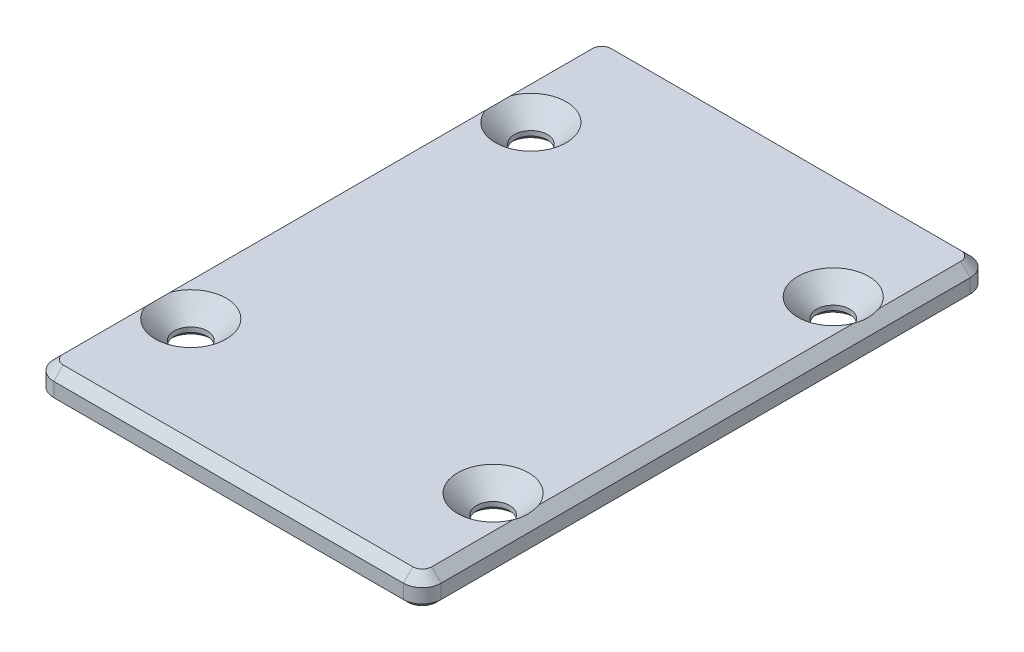
ISO-10303-21;
HEADER;
FILE_DESCRIPTION(('STEP AP214'),'2;1');
FILE_NAME('part.step','',(''),(''),'','','');
FILE_SCHEMA(('AUTOMOTIVE_DESIGN { 1 0 10303 214 1 1 1 1 }'));
ENDSEC;
DATA;
#1=APPLICATION_CONTEXT('core data for automotive mechanical design processes');
#2=APPLICATION_PROTOCOL_DEFINITION('international standard','automotive_design',2000,#1);
#3=PRODUCT_CONTEXT('',#1,'mechanical');
#4=PRODUCT('Part','Part','',(#3));
#5=PRODUCT_RELATED_PRODUCT_CATEGORY('part','',(#4));
#6=PRODUCT_DEFINITION_FORMATION('','',#4);
#7=PRODUCT_DEFINITION_CONTEXT('part definition',#1,'design');
#8=PRODUCT_DEFINITION('design','',#6,#7);
#9=PRODUCT_DEFINITION_SHAPE('','',#8);
#10=(LENGTH_UNIT() NAMED_UNIT(*) SI_UNIT(.MILLI.,.METRE.));
#11=(NAMED_UNIT(*) PLANE_ANGLE_UNIT() SI_UNIT($,.RADIAN.));
#12=(NAMED_UNIT(*) SI_UNIT($,.STERADIAN.) SOLID_ANGLE_UNIT());
#13=UNCERTAINTY_MEASURE_WITH_UNIT(LENGTH_MEASURE(1.E-05),#10,'distance_accuracy_value','');
#14=(GEOMETRIC_REPRESENTATION_CONTEXT(3) GLOBAL_UNCERTAINTY_ASSIGNED_CONTEXT((#13)) GLOBAL_UNIT_ASSIGNED_CONTEXT((#10,
#11,#12)) REPRESENTATION_CONTEXT('',''));
#15=CARTESIAN_POINT('',(0.,0.,0.));
#16=DIRECTION('',(0.,0.,1.));
#17=DIRECTION('',(1.,0.,0.));
#18=AXIS2_PLACEMENT_3D('',#15,#16,#17);
#19=CARTESIAN_POINT('',(20.5,3.,30.));
#20=DIRECTION('',(-1.,0.,0.));
#21=DIRECTION('',(0.,0.,1.));
#22=AXIS2_PLACEMENT_3D('',#19,#20,#21);
#23=PLANE('',#22);
#24=DIRECTION('',(0.,-1.,0.));
#25=VECTOR('',#24,1.);
#26=CARTESIAN_POINT('',(20.5,3.,28.));
#27=LINE('',#26,#25);
#28=CARTESIAN_POINT('',(20.5,1.99999999999998,28.));
#29=VERTEX_POINT('',#28);
#30=CARTESIAN_POINT('',(20.5,0.499999999999994,28.));
#31=VERTEX_POINT('',#30);
#32=EDGE_CURVE('E248',#29,#31,#27,.T.);
#33=ORIENTED_EDGE('',*,*,#32,.T.);
#34=DIRECTION('',(0.,0.,-1.));
#35=VECTOR('',#34,1.);
#36=CARTESIAN_POINT('',(20.5,0.499999999999994,-28.));
#37=LINE('',#36,#35);
#38=CARTESIAN_POINT('',(20.5,0.499999999999994,-28.));
#39=VERTEX_POINT('',#38);
#40=EDGE_CURVE('E68',#31,#39,#37,.T.);
#41=ORIENTED_EDGE('',*,*,#40,.T.);
#42=DIRECTION('',(0.,-1.,0.));
#43=VECTOR('',#42,1.);
#44=CARTESIAN_POINT('',(20.5,3.,-28.));
#45=LINE('',#44,#43);
#46=CARTESIAN_POINT('',(20.5,1.99999999999998,-28.));
#47=VERTEX_POINT('',#46);
#48=EDGE_CURVE('E245',#39,#47,#45,.F.);
#49=ORIENTED_EDGE('',*,*,#48,.T.);
#50=DIRECTION('',(0.,0.,1.));
#51=VECTOR('',#50,1.);
#52=CARTESIAN_POINT('',(20.5,1.99999999999998,30.));
#53=LINE('',#52,#51);
#54=EDGE_CURVE('E272',#47,#29,#53,.T.);
#55=ORIENTED_EDGE('',*,*,#54,.T.);
#56=EDGE_LOOP('',(#33,#41,#49,#55));
#57=FACE_BOUND('',#56,.T.);
#58=ADVANCED_FACE('F41',(#57),#23,.F.);
#59=CARTESIAN_POINT('',(-20.5,3.,-30.));
#60=DIRECTION('',(0.,0.,1.));
#61=DIRECTION('',(1.,0.,0.));
#62=AXIS2_PLACEMENT_3D('',#59,#60,#61);
#63=PLANE('',#62);
#64=DIRECTION('',(0.,-1.,0.));
#65=VECTOR('',#64,1.);
#66=CARTESIAN_POINT('',(18.5,3.,-30.));
#67=LINE('',#66,#65);
#68=CARTESIAN_POINT('',(18.5,1.99999999999998,-30.));
#69=VERTEX_POINT('',#68);
#70=CARTESIAN_POINT('',(18.5,0.499999999999994,-30.));
#71=VERTEX_POINT('',#70);
#72=EDGE_CURVE('E251',#69,#71,#67,.T.);
#73=ORIENTED_EDGE('',*,*,#72,.T.);
#74=DIRECTION('',(-1.,0.,0.));
#75=VECTOR('',#74,1.);
#76=CARTESIAN_POINT('',(-18.5,0.499999999999994,-30.));
#77=LINE('',#76,#75);
#78=CARTESIAN_POINT('',(-18.5,0.499999999999994,-30.));
#79=VERTEX_POINT('',#78);
#80=EDGE_CURVE('E568',#71,#79,#77,.T.);
#81=ORIENTED_EDGE('',*,*,#80,.T.);
#82=DIRECTION('',(0.,-1.,0.));
#83=VECTOR('',#82,1.);
#84=CARTESIAN_POINT('',(-18.5,3.,-30.));
#85=LINE('',#84,#83);
#86=CARTESIAN_POINT('',(-18.5,1.99999999999998,-30.));
#87=VERTEX_POINT('',#86);
#88=EDGE_CURVE('E254',#79,#87,#85,.F.);
#89=ORIENTED_EDGE('',*,*,#88,.T.);
#90=DIRECTION('',(1.,0.,0.));
#91=VECTOR('',#90,1.);
#92=CARTESIAN_POINT('',(-20.5,1.99999999999999,-30.));
#93=LINE('',#92,#91);
#94=EDGE_CURVE('E474',#87,#69,#93,.T.);
#95=ORIENTED_EDGE('',*,*,#94,.T.);
#96=EDGE_LOOP('',(#73,#81,#89,#95));
#97=FACE_BOUND('',#96,.T.);
#98=ADVANCED_FACE('F391',(#97),#63,.F.);
#99=CARTESIAN_POINT('',(-20.5,3.,30.));
#100=DIRECTION('',(1.,0.,0.));
#101=DIRECTION('',(0.,0.,-1.));
#102=AXIS2_PLACEMENT_3D('',#99,#100,#101);
#103=PLANE('',#102);
#104=DIRECTION('',(0.,-1.,0.));
#105=VECTOR('',#104,1.);
#106=CARTESIAN_POINT('',(-20.5,3.,-28.));
#107=LINE('',#106,#105);
#108=CARTESIAN_POINT('',(-20.5,1.99999999999998,-28.));
#109=VERTEX_POINT('',#108);
#110=CARTESIAN_POINT('',(-20.5,0.499999999999994,-28.));
#111=VERTEX_POINT('',#110);
#112=EDGE_CURVE('E236',#109,#111,#107,.T.);
#113=ORIENTED_EDGE('',*,*,#112,.T.);
#114=DIRECTION('',(0.,0.,1.));
#115=VECTOR('',#114,1.);
#116=CARTESIAN_POINT('',(-20.5,0.499999999999994,28.));
#117=LINE('',#116,#115);
#118=CARTESIAN_POINT('',(-20.5,0.499999999999994,28.));
#119=VERTEX_POINT('',#118);
#120=EDGE_CURVE('E552',#111,#119,#117,.T.);
#121=ORIENTED_EDGE('',*,*,#120,.T.);
#122=DIRECTION('',(0.,-1.,0.));
#123=VECTOR('',#122,1.);
#124=CARTESIAN_POINT('',(-20.5,3.,28.));
#125=LINE('',#124,#123);
#126=CARTESIAN_POINT('',(-20.5,1.99999999999998,28.));
#127=VERTEX_POINT('',#126);
#128=EDGE_CURVE('E242',#119,#127,#125,.F.);
#129=ORIENTED_EDGE('',*,*,#128,.T.);
#130=DIRECTION('',(0.,0.,-1.));
#131=VECTOR('',#130,1.);
#132=CARTESIAN_POINT('',(-20.5,1.99999999999998,30.));
#133=LINE('',#132,#131);
#134=EDGE_CURVE('E471',#127,#109,#133,.T.);
#135=ORIENTED_EDGE('',*,*,#134,.T.);
#136=EDGE_LOOP('',(#113,#121,#129,#135));
#137=FACE_BOUND('',#136,.T.);
#138=ADVANCED_FACE('F396',(#137),#103,.F.);
#139=CARTESIAN_POINT('',(-20.5,3.,30.));
#140=DIRECTION('',(0.,0.,-1.));
#141=DIRECTION('',(-1.,0.,0.));
#142=AXIS2_PLACEMENT_3D('',#139,#140,#141);
#143=PLANE('',#142);
#144=DIRECTION('',(0.,-1.,0.));
#145=VECTOR('',#144,1.);
#146=CARTESIAN_POINT('',(-18.5,3.,30.));
#147=LINE('',#146,#145);
#148=CARTESIAN_POINT('',(-18.5,1.99999999999998,30.));
#149=VERTEX_POINT('',#148);
#150=CARTESIAN_POINT('',(-18.5,0.499999999999994,30.));
#151=VERTEX_POINT('',#150);
#152=EDGE_CURVE('E225',#149,#151,#147,.T.);
#153=ORIENTED_EDGE('',*,*,#152,.T.);
#154=DIRECTION('',(1.,0.,0.));
#155=VECTOR('',#154,1.);
#156=CARTESIAN_POINT('',(18.5,0.499999999999994,30.));
#157=LINE('',#156,#155);
#158=CARTESIAN_POINT('',(18.5,0.499999999999994,30.));
#159=VERTEX_POINT('',#158);
#160=EDGE_CURVE('E558',#151,#159,#157,.T.);
#161=ORIENTED_EDGE('',*,*,#160,.T.);
#162=DIRECTION('',(0.,-1.,0.));
#163=VECTOR('',#162,1.);
#164=CARTESIAN_POINT('',(18.5,3.,30.));
#165=LINE('',#164,#163);
#166=CARTESIAN_POINT('',(18.5,1.99999999999998,30.));
#167=VERTEX_POINT('',#166);
#168=EDGE_CURVE('E231',#159,#167,#165,.F.);
#169=ORIENTED_EDGE('',*,*,#168,.T.);
#170=DIRECTION('',(-1.,0.,0.));
#171=VECTOR('',#170,1.);
#172=CARTESIAN_POINT('',(-20.5,1.99999999999998,30.));
#173=LINE('',#172,#171);
#174=EDGE_CURVE('E461',#167,#149,#173,.T.);
#175=ORIENTED_EDGE('',*,*,#174,.T.);
#176=EDGE_LOOP('',(#153,#161,#169,#175));
#177=FACE_BOUND('',#176,.T.);
#178=ADVANCED_FACE('F660',(#177),#143,.F.);
#179=CARTESIAN_POINT('',(0.,3.,0.));
#180=DIRECTION('',(0.,-1.,0.));
#181=DIRECTION('',(0.,0.,-1.));
#182=AXIS2_PLACEMENT_3D('',#179,#180,#181);
#183=PLANE('',#182);
#184=DIRECTION('',(0.,0.,1.));
#185=VECTOR('',#184,1.);
#186=CARTESIAN_POINT('',(-19.5,3.,0.));
#187=LINE('',#186,#185);
#188=CARTESIAN_POINT('',(-19.5,3.,-16.6537087982163));
#189=VERTEX_POINT('',#188);
#190=CARTESIAN_POINT('',(-19.5,3.,16.6537087982164));
#191=VERTEX_POINT('',#190);
#192=EDGE_CURVE('E488',#189,#191,#187,.T.);
#193=ORIENTED_EDGE('',*,*,#192,.T.);
#194=CARTESIAN_POINT('',(-16.,3.,18.));
#195=DIRECTION('',(0.,-1.,0.));
#196=DIRECTION('',(0.,0.,-1.));
#197=AXIS2_PLACEMENT_3D('',#194,#195,#196);
#198=CIRCLE('',#197,3.75);
#199=CARTESIAN_POINT('',(-19.5,3.,19.3462912017836));
#200=VERTEX_POINT('',#199);
#201=EDGE_CURVE('E282',#191,#200,#198,.T.);
#202=ORIENTED_EDGE('',*,*,#201,.T.);
#203=CARTESIAN_POINT('',(-19.5,3.,28.));
#204=VERTEX_POINT('',#203);
#205=EDGE_CURVE('E489',#200,#204,#187,.T.);
#206=ORIENTED_EDGE('',*,*,#205,.T.);
#207=CARTESIAN_POINT('',(-18.5,3.,28.));
#208=DIRECTION('',(0.,-1.,0.));
#209=DIRECTION('',(0.,0.,-1.));
#210=AXIS2_PLACEMENT_3D('',#207,#208,#209);
#211=CIRCLE('',#210,0.999999999999987);
#212=CARTESIAN_POINT('',(-18.5,3.,29.));
#213=VERTEX_POINT('',#212);
#214=EDGE_CURVE('E490',#204,#213,#211,.F.);
#215=ORIENTED_EDGE('',*,*,#214,.T.);
#216=DIRECTION('',(1.,0.,0.));
#217=VECTOR('',#216,1.);
#218=CARTESIAN_POINT('',(0.,3.,29.));
#219=LINE('',#218,#217);
#220=CARTESIAN_POINT('',(18.5,3.,29.));
#221=VERTEX_POINT('',#220);
#222=EDGE_CURVE('E193',#213,#221,#219,.T.);
#223=ORIENTED_EDGE('',*,*,#222,.T.);
#224=CARTESIAN_POINT('',(18.5,3.,28.));
#225=DIRECTION('',(0.,-1.,0.));
#226=DIRECTION('',(0.,0.,-1.));
#227=AXIS2_PLACEMENT_3D('',#224,#225,#226);
#228=CIRCLE('',#227,0.999999999999984);
#229=CARTESIAN_POINT('',(19.5,3.,28.));
#230=VERTEX_POINT('',#229);
#231=EDGE_CURVE('E184',#221,#230,#228,.F.);
#232=ORIENTED_EDGE('',*,*,#231,.T.);
#233=DIRECTION('',(0.,0.,-1.));
#234=VECTOR('',#233,1.);
#235=CARTESIAN_POINT('',(19.5,3.,0.));
#236=LINE('',#235,#234);
#237=CARTESIAN_POINT('',(19.5,3.,19.3462912017837));
#238=VERTEX_POINT('',#237);
#239=EDGE_CURVE('E190',#230,#238,#236,.T.);
#240=ORIENTED_EDGE('',*,*,#239,.T.);
#241=CARTESIAN_POINT('',(16.,3.,18.));
#242=DIRECTION('',(0.,-1.,0.));
#243=DIRECTION('',(0.,0.,-1.));
#244=AXIS2_PLACEMENT_3D('',#241,#242,#243);
#245=CIRCLE('',#244,3.75000000000001);
#246=CARTESIAN_POINT('',(19.5,3.,16.6537087982163));
#247=VERTEX_POINT('',#246);
#248=EDGE_CURVE('E279',#238,#247,#245,.T.);
#249=ORIENTED_EDGE('',*,*,#248,.T.);
#250=CARTESIAN_POINT('',(19.5,3.,-16.6537087982163));
#251=VERTEX_POINT('',#250);
#252=EDGE_CURVE('E216',#247,#251,#236,.T.);
#253=ORIENTED_EDGE('',*,*,#252,.T.);
#254=CARTESIAN_POINT('',(16.,3.,-18.));
#255=DIRECTION('',(0.,-1.,0.));
#256=DIRECTION('',(0.,0.,-1.));
#257=AXIS2_PLACEMENT_3D('',#254,#255,#256);
#258=CIRCLE('',#257,3.75000000000001);
#259=CARTESIAN_POINT('',(19.5,3.,-19.3462912017837));
#260=VERTEX_POINT('',#259);
#261=EDGE_CURVE('E271',#251,#260,#258,.T.);
#262=ORIENTED_EDGE('',*,*,#261,.T.);
#263=CARTESIAN_POINT('',(19.5,3.,-28.));
#264=VERTEX_POINT('',#263);
#265=EDGE_CURVE('E218',#260,#264,#236,.T.);
#266=ORIENTED_EDGE('',*,*,#265,.T.);
#267=CARTESIAN_POINT('',(18.5,3.,-28.));
#268=DIRECTION('',(0.,-1.,0.));
#269=DIRECTION('',(0.,0.,-1.));
#270=AXIS2_PLACEMENT_3D('',#267,#268,#269);
#271=CIRCLE('',#270,0.999999999999987);
#272=CARTESIAN_POINT('',(18.5,3.,-29.));
#273=VERTEX_POINT('',#272);
#274=EDGE_CURVE('E198',#264,#273,#271,.F.);
#275=ORIENTED_EDGE('',*,*,#274,.T.);
#276=DIRECTION('',(-1.,0.,0.));
#277=VECTOR('',#276,1.);
#278=CARTESIAN_POINT('',(0.,3.,-29.));
#279=LINE('',#278,#277);
#280=CARTESIAN_POINT('',(-18.5,3.,-29.));
#281=VERTEX_POINT('',#280);
#282=EDGE_CURVE('E480',#273,#281,#279,.T.);
#283=ORIENTED_EDGE('',*,*,#282,.T.);
#284=CARTESIAN_POINT('',(-18.5,3.,-28.));
#285=DIRECTION('',(0.,-1.,0.));
#286=DIRECTION('',(0.,0.,-1.));
#287=AXIS2_PLACEMENT_3D('',#284,#285,#286);
#288=CIRCLE('',#287,0.999999999999984);
#289=CARTESIAN_POINT('',(-19.5,3.,-28.));
#290=VERTEX_POINT('',#289);
#291=EDGE_CURVE('E477',#281,#290,#288,.F.);
#292=ORIENTED_EDGE('',*,*,#291,.T.);
#293=CARTESIAN_POINT('',(-19.5,3.,-19.3462912017837));
#294=VERTEX_POINT('',#293);
#295=EDGE_CURVE('E484',#290,#294,#187,.T.);
#296=ORIENTED_EDGE('',*,*,#295,.T.);
#297=CARTESIAN_POINT('',(-16.,3.,-18.));
#298=DIRECTION('',(0.,-1.,0.));
#299=DIRECTION('',(0.,0.,-1.));
#300=AXIS2_PLACEMENT_3D('',#297,#298,#299);
#301=CIRCLE('',#300,3.75);
#302=EDGE_CURVE('E275',#294,#189,#301,.T.);
#303=ORIENTED_EDGE('',*,*,#302,.T.);
#304=EDGE_LOOP('',(#193,#202,#206,#215,#223,#232,#240,#249,#253,#262,#266,#275,#283,#292,#296,#303));
#305=FACE_BOUND('',#304,.T.);
#306=ADVANCED_FACE('F187',(#305),#183,.F.);
#307=CARTESIAN_POINT('',(0.,0.,0.));
#308=DIRECTION('',(0.,-1.,0.));
#309=DIRECTION('',(0.,0.,-1.));
#310=AXIS2_PLACEMENT_3D('',#307,#308,#309);
#311=PLANE('',#310);
#312=DIRECTION('',(0.,0.,-1.));
#313=VECTOR('',#312,1.);
#314=CARTESIAN_POINT('',(-20.,0.,-28.));
#315=LINE('',#314,#313);
#316=CARTESIAN_POINT('',(-20.,0.,28.));
#317=VERTEX_POINT('',#316);
#318=CARTESIAN_POINT('',(-20.,0.,-28.));
#319=VERTEX_POINT('',#318);
#320=EDGE_CURVE('E541',#317,#319,#315,.T.);
#321=ORIENTED_EDGE('',*,*,#320,.T.);
#322=CARTESIAN_POINT('',(-18.5,0.,-28.));
#323=DIRECTION('',(0.,-1.,0.));
#324=DIRECTION('',(0.,0.,-1.));
#325=AXIS2_PLACEMENT_3D('',#322,#323,#324);
#326=CIRCLE('',#325,1.5);
#327=CARTESIAN_POINT('',(-18.5,0.,-29.5));
#328=VERTEX_POINT('',#327);
#329=EDGE_CURVE('E544',#319,#328,#326,.T.);
#330=ORIENTED_EDGE('',*,*,#329,.T.);
#331=DIRECTION('',(1.,0.,0.));
#332=VECTOR('',#331,1.);
#333=CARTESIAN_POINT('',(18.5,0.,-29.5));
#334=LINE('',#333,#332);
#335=CARTESIAN_POINT('',(18.5,0.,-29.5));
#336=VERTEX_POINT('',#335);
#337=EDGE_CURVE('E523',#328,#336,#334,.T.);
#338=ORIENTED_EDGE('',*,*,#337,.T.);
#339=CARTESIAN_POINT('',(18.5,0.,-28.));
#340=DIRECTION('',(0.,-1.,0.));
#341=DIRECTION('',(0.,0.,-1.));
#342=AXIS2_PLACEMENT_3D('',#339,#340,#341);
#343=CIRCLE('',#342,1.50000000000001);
#344=CARTESIAN_POINT('',(20.,0.,-28.));
#345=VERTEX_POINT('',#344);
#346=EDGE_CURVE('E526',#336,#345,#343,.T.);
#347=ORIENTED_EDGE('',*,*,#346,.T.);
#348=DIRECTION('',(0.,0.,1.));
#349=VECTOR('',#348,1.);
#350=CARTESIAN_POINT('',(20.,0.,28.));
#351=LINE('',#350,#349);
#352=CARTESIAN_POINT('',(20.,0.,28.));
#353=VERTEX_POINT('',#352);
#354=EDGE_CURVE('E529',#345,#353,#351,.T.);
#355=ORIENTED_EDGE('',*,*,#354,.T.);
#356=CARTESIAN_POINT('',(18.5,0.,28.));
#357=DIRECTION('',(0.,-1.,0.));
#358=DIRECTION('',(0.,0.,-1.));
#359=AXIS2_PLACEMENT_3D('',#356,#357,#358);
#360=CIRCLE('',#359,1.5);
#361=CARTESIAN_POINT('',(18.5,0.,29.5));
#362=VERTEX_POINT('',#361);
#363=EDGE_CURVE('E532',#353,#362,#360,.T.);
#364=ORIENTED_EDGE('',*,*,#363,.T.);
#365=DIRECTION('',(-1.,0.,0.));
#366=VECTOR('',#365,1.);
#367=CARTESIAN_POINT('',(-18.5,0.,29.5));
#368=LINE('',#367,#366);
#369=CARTESIAN_POINT('',(-18.5,0.,29.5));
#370=VERTEX_POINT('',#369);
#371=EDGE_CURVE('E535',#362,#370,#368,.T.);
#372=ORIENTED_EDGE('',*,*,#371,.T.);
#373=CARTESIAN_POINT('',(-18.5,0.,28.));
#374=DIRECTION('',(0.,-1.,0.));
#375=DIRECTION('',(0.,0.,-1.));
#376=AXIS2_PLACEMENT_3D('',#373,#374,#375);
#377=CIRCLE('',#376,1.50000000000001);
#378=EDGE_CURVE('E538',#370,#317,#377,.T.);
#379=ORIENTED_EDGE('',*,*,#378,.T.);
#380=EDGE_LOOP('',(#321,#330,#338,#347,#355,#364,#372,#379));
#381=FACE_BOUND('',#380,.T.);
#382=CARTESIAN_POINT('',(16.,0.,-18.));
#383=DIRECTION('',(0.,-1.,0.));
#384=DIRECTION('',(0.,0.,-1.));
#385=AXIS2_PLACEMENT_3D('',#382,#383,#384);
#386=CIRCLE('',#385,2.25000000000001);
#387=CARTESIAN_POINT('',(16.,0.,-20.25));
#388=VERTEX_POINT('',#387);
#389=EDGE_CURVE('E519',#388,#388,#386,.F.);
#390=ORIENTED_EDGE('',*,*,#389,.T.);
#391=EDGE_LOOP('',(#390));
#392=FACE_BOUND('',#391,.T.);
#393=CARTESIAN_POINT('',(16.,0.,18.));
#394=DIRECTION('',(0.,-1.,0.));
#395=DIRECTION('',(0.,0.,-1.));
#396=AXIS2_PLACEMENT_3D('',#393,#394,#395);
#397=CIRCLE('',#396,2.25000000000001);
#398=CARTESIAN_POINT('',(16.,0.,15.75));
#399=VERTEX_POINT('',#398);
#400=EDGE_CURVE('E515',#399,#399,#397,.F.);
#401=ORIENTED_EDGE('',*,*,#400,.T.);
#402=EDGE_LOOP('',(#401));
#403=FACE_BOUND('',#402,.T.);
#404=CARTESIAN_POINT('',(-16.,0.,18.));
#405=DIRECTION('',(0.,-1.,0.));
#406=DIRECTION('',(0.,0.,-1.));
#407=AXIS2_PLACEMENT_3D('',#404,#405,#406);
#408=CIRCLE('',#407,2.25);
#409=CARTESIAN_POINT('',(-16.,0.,15.75));
#410=VERTEX_POINT('',#409);
#411=EDGE_CURVE('E511',#410,#410,#408,.F.);
#412=ORIENTED_EDGE('',*,*,#411,.T.);
#413=EDGE_LOOP('',(#412));
#414=FACE_BOUND('',#413,.T.);
#415=CARTESIAN_POINT('',(-16.,0.,-18.));
#416=DIRECTION('',(0.,-1.,0.));
#417=DIRECTION('',(0.,0.,-1.));
#418=AXIS2_PLACEMENT_3D('',#415,#416,#417);
#419=CIRCLE('',#418,2.25);
#420=CARTESIAN_POINT('',(-16.,0.,-20.25));
#421=VERTEX_POINT('',#420);
#422=EDGE_CURVE('E507',#421,#421,#419,.F.);
#423=ORIENTED_EDGE('',*,*,#422,.T.);
#424=EDGE_LOOP('',(#423));
#425=FACE_BOUND('',#424,.T.);
#426=ADVANCED_FACE('F670',(#381,#392,#403,#414,#425),#311,.T.);
#427=CARTESIAN_POINT('',(16.,0.,-18.));
#428=DIRECTION('',(0.,1.,0.));
#429=DIRECTION('',(0.,0.,1.));
#430=AXIS2_PLACEMENT_3D('',#427,#428,#429);
#431=CYLINDRICAL_SURFACE('',#430,1.75);
#432=CARTESIAN_POINT('',(16.,0.500000000000008,-18.));
#433=DIRECTION('',(0.,-1.,0.));
#434=DIRECTION('',(0.,0.,-1.));
#435=AXIS2_PLACEMENT_3D('',#432,#433,#434);
#436=CIRCLE('',#435,1.75);
#437=CARTESIAN_POINT('',(16.,0.500000000000008,-19.75));
#438=VERTEX_POINT('',#437);
#439=EDGE_CURVE('E571',#438,#438,#436,.T.);
#440=ORIENTED_EDGE('',*,*,#439,.T.);
#441=EDGE_LOOP('',(#440));
#442=FACE_BOUND('',#441,.T.);
#443=CARTESIAN_POINT('',(16.,1.,-18.));
#444=DIRECTION('',(0.,-1.,0.));
#445=DIRECTION('',(0.,0.,-1.));
#446=AXIS2_PLACEMENT_3D('',#443,#444,#445);
#447=CIRCLE('',#446,1.75);
#448=CARTESIAN_POINT('',(16.,1.,-19.75));
#449=VERTEX_POINT('',#448);
#450=EDGE_CURVE('E504',#449,#449,#447,.F.);
#451=ORIENTED_EDGE('',*,*,#450,.T.);
#452=EDGE_LOOP('',(#451));
#453=FACE_BOUND('',#452,.T.);
#454=ADVANCED_FACE('F722',(#442,#453),#431,.F.);
#455=CARTESIAN_POINT('',(16.,0.,18.));
#456=DIRECTION('',(0.,1.,0.));
#457=DIRECTION('',(0.,0.,1.));
#458=AXIS2_PLACEMENT_3D('',#455,#456,#457);
#459=CYLINDRICAL_SURFACE('',#458,1.75);
#460=CARTESIAN_POINT('',(16.,0.500000000000008,18.));
#461=DIRECTION('',(0.,-1.,0.));
#462=DIRECTION('',(0.,0.,-1.));
#463=AXIS2_PLACEMENT_3D('',#460,#461,#462);
#464=CIRCLE('',#463,1.75);
#465=CARTESIAN_POINT('',(16.,0.500000000000008,16.25));
#466=VERTEX_POINT('',#465);
#467=EDGE_CURVE('E575',#466,#466,#464,.T.);
#468=ORIENTED_EDGE('',*,*,#467,.T.);
#469=EDGE_LOOP('',(#468));
#470=FACE_BOUND('',#469,.T.);
#471=CARTESIAN_POINT('',(16.,1.,18.));
#472=DIRECTION('',(0.,-1.,0.));
#473=DIRECTION('',(0.,0.,-1.));
#474=AXIS2_PLACEMENT_3D('',#471,#472,#473);
#475=CIRCLE('',#474,1.75);
#476=CARTESIAN_POINT('',(16.,1.,16.25));
#477=VERTEX_POINT('',#476);
#478=EDGE_CURVE('E340',#477,#477,#475,.F.);
#479=ORIENTED_EDGE('',*,*,#478,.T.);
#480=EDGE_LOOP('',(#479));
#481=FACE_BOUND('',#480,.T.);
#482=ADVANCED_FACE('F730',(#470,#481),#459,.F.);
#483=CARTESIAN_POINT('',(-16.,0.,18.));
#484=DIRECTION('',(0.,1.,0.));
#485=DIRECTION('',(0.,0.,1.));
#486=AXIS2_PLACEMENT_3D('',#483,#484,#485);
#487=CYLINDRICAL_SURFACE('',#486,1.75);
#488=CARTESIAN_POINT('',(-16.,0.500000000000004,18.));
#489=DIRECTION('',(0.,-1.,0.));
#490=DIRECTION('',(0.,0.,-1.));
#491=AXIS2_PLACEMENT_3D('',#488,#489,#490);
#492=CIRCLE('',#491,1.75);
#493=CARTESIAN_POINT('',(-16.,0.500000000000004,16.25));
#494=VERTEX_POINT('',#493);
#495=EDGE_CURVE('E52',#494,#494,#492,.T.);
#496=ORIENTED_EDGE('',*,*,#495,.T.);
#497=EDGE_LOOP('',(#496));
#498=FACE_BOUND('',#497,.T.);
#499=CARTESIAN_POINT('',(-16.,1.00000000000001,18.));
#500=DIRECTION('',(0.,-1.,0.));
#501=DIRECTION('',(0.,0.,-1.));
#502=AXIS2_PLACEMENT_3D('',#499,#500,#501);
#503=CIRCLE('',#502,1.75);
#504=CARTESIAN_POINT('',(-16.,1.00000000000001,16.25));
#505=VERTEX_POINT('',#504);
#506=EDGE_CURVE('E267',#505,#505,#503,.F.);
#507=ORIENTED_EDGE('',*,*,#506,.T.);
#508=EDGE_LOOP('',(#507));
#509=FACE_BOUND('',#508,.T.);
#510=ADVANCED_FACE('F922',(#498,#509),#487,.F.);
#511=CARTESIAN_POINT('',(-16.,0.,-18.));
#512=DIRECTION('',(0.,1.,0.));
#513=DIRECTION('',(0.,0.,1.));
#514=AXIS2_PLACEMENT_3D('',#511,#512,#513);
#515=CYLINDRICAL_SURFACE('',#514,1.75);
#516=CARTESIAN_POINT('',(-16.,0.500000000000004,-18.));
#517=DIRECTION('',(0.,-1.,0.));
#518=DIRECTION('',(0.,0.,-1.));
#519=AXIS2_PLACEMENT_3D('',#516,#517,#518);
#520=CIRCLE('',#519,1.75);
#521=CARTESIAN_POINT('',(-16.,0.500000000000004,-19.75));
#522=VERTEX_POINT('',#521);
#523=EDGE_CURVE('E11',#522,#522,#520,.T.);
#524=ORIENTED_EDGE('',*,*,#523,.T.);
#525=EDGE_LOOP('',(#524));
#526=FACE_BOUND('',#525,.T.);
#527=CARTESIAN_POINT('',(-16.,1.00000000000001,-18.));
#528=DIRECTION('',(0.,-1.,0.));
#529=DIRECTION('',(0.,0.,-1.));
#530=AXIS2_PLACEMENT_3D('',#527,#528,#529);
#531=CIRCLE('',#530,1.75);
#532=CARTESIAN_POINT('',(-16.,1.00000000000001,-19.75));
#533=VERTEX_POINT('',#532);
#534=EDGE_CURVE('E501',#533,#533,#531,.F.);
#535=ORIENTED_EDGE('',*,*,#534,.T.);
#536=EDGE_LOOP('',(#535));
#537=FACE_BOUND('',#536,.T.);
#538=ADVANCED_FACE('F404',(#526,#537),#515,.F.);
#539=CARTESIAN_POINT('',(18.5,3.,-28.));
#540=DIRECTION('',(0.,-1.,0.));
#541=DIRECTION('',(0.,0.,-1.));
#542=AXIS2_PLACEMENT_3D('',#539,#540,#541);
#543=CYLINDRICAL_SURFACE('',#542,2.);
#544=ORIENTED_EDGE('',*,*,#48,.F.);
#545=CARTESIAN_POINT('',(18.5,0.499999999999994,-28.));
#546=DIRECTION('',(0.,-1.,0.));
#547=DIRECTION('',(0.,0.,-1.));
#548=AXIS2_PLACEMENT_3D('',#545,#546,#547);
#549=CIRCLE('',#548,2.);
#550=EDGE_CURVE('E60',#39,#71,#549,.F.);
#551=ORIENTED_EDGE('',*,*,#550,.T.);
#552=ORIENTED_EDGE('',*,*,#72,.F.);
#553=CARTESIAN_POINT('',(18.5,1.99999999999998,-28.));
#554=DIRECTION('',(0.,-1.,0.));
#555=DIRECTION('',(0.,0.,-1.));
#556=AXIS2_PLACEMENT_3D('',#553,#554,#555);
#557=CIRCLE('',#556,2.);
#558=EDGE_CURVE('E438',#69,#47,#557,.T.);
#559=ORIENTED_EDGE('',*,*,#558,.T.);
#560=EDGE_LOOP('',(#544,#551,#552,#559));
#561=FACE_BOUND('',#560,.T.);
#562=ADVANCED_FACE('F400',(#561),#543,.T.);
#563=CARTESIAN_POINT('',(-18.5,3.,-28.));
#564=DIRECTION('',(0.,-1.,0.));
#565=DIRECTION('',(0.,0.,-1.));
#566=AXIS2_PLACEMENT_3D('',#563,#564,#565);
#567=CYLINDRICAL_SURFACE('',#566,2.);
#568=ORIENTED_EDGE('',*,*,#88,.F.);
#569=CARTESIAN_POINT('',(-18.5,0.499999999999994,-28.));
#570=DIRECTION('',(0.,-1.,0.));
#571=DIRECTION('',(0.,0.,-1.));
#572=AXIS2_PLACEMENT_3D('',#569,#570,#571);
#573=CIRCLE('',#572,2.);
#574=EDGE_CURVE('E548',#79,#111,#573,.F.);
#575=ORIENTED_EDGE('',*,*,#574,.T.);
#576=ORIENTED_EDGE('',*,*,#112,.F.);
#577=CARTESIAN_POINT('',(-18.5,1.99999999999998,-28.));
#578=DIRECTION('',(0.,-1.,0.));
#579=DIRECTION('',(0.,0.,-1.));
#580=AXIS2_PLACEMENT_3D('',#577,#578,#579);
#581=CIRCLE('',#580,2.);
#582=EDGE_CURVE('E464',#109,#87,#581,.T.);
#583=ORIENTED_EDGE('',*,*,#582,.T.);
#584=EDGE_LOOP('',(#568,#575,#576,#583));
#585=FACE_BOUND('',#584,.T.);
#586=ADVANCED_FACE('F403',(#585),#567,.T.);
#587=CARTESIAN_POINT('',(-18.5,3.,28.));
#588=DIRECTION('',(0.,-1.,0.));
#589=DIRECTION('',(0.,0.,-1.));
#590=AXIS2_PLACEMENT_3D('',#587,#588,#589);
#591=CYLINDRICAL_SURFACE('',#590,2.);
#592=ORIENTED_EDGE('',*,*,#128,.F.);
#593=CARTESIAN_POINT('',(-18.5,0.499999999999994,28.));
#594=DIRECTION('',(0.,-1.,0.));
#595=DIRECTION('',(0.,0.,-1.));
#596=AXIS2_PLACEMENT_3D('',#593,#594,#595);
#597=CIRCLE('',#596,2.);
#598=EDGE_CURVE('E555',#119,#151,#597,.F.);
#599=ORIENTED_EDGE('',*,*,#598,.T.);
#600=ORIENTED_EDGE('',*,*,#152,.F.);
#601=CARTESIAN_POINT('',(-18.5,1.99999999999998,28.));
#602=DIRECTION('',(0.,-1.,0.));
#603=DIRECTION('',(0.,0.,-1.));
#604=AXIS2_PLACEMENT_3D('',#601,#602,#603);
#605=CIRCLE('',#604,2.);
#606=EDGE_CURVE('E467',#149,#127,#605,.T.);
#607=ORIENTED_EDGE('',*,*,#606,.T.);
#608=EDGE_LOOP('',(#592,#599,#600,#607));
#609=FACE_BOUND('',#608,.T.);
#610=ADVANCED_FACE('F407',(#609),#591,.T.);
#611=CARTESIAN_POINT('',(18.5,3.,28.));
#612=DIRECTION('',(0.,-1.,0.));
#613=DIRECTION('',(0.,0.,-1.));
#614=AXIS2_PLACEMENT_3D('',#611,#612,#613);
#615=CYLINDRICAL_SURFACE('',#614,2.);
#616=ORIENTED_EDGE('',*,*,#168,.F.);
#617=CARTESIAN_POINT('',(18.5,0.499999999999994,28.));
#618=DIRECTION('',(0.,-1.,0.));
#619=DIRECTION('',(0.,0.,-1.));
#620=AXIS2_PLACEMENT_3D('',#617,#618,#619);
#621=CIRCLE('',#620,2.);
#622=EDGE_CURVE('E561',#159,#31,#621,.F.);
#623=ORIENTED_EDGE('',*,*,#622,.T.);
#624=ORIENTED_EDGE('',*,*,#32,.F.);
#625=CARTESIAN_POINT('',(18.5,1.99999999999998,28.));
#626=DIRECTION('',(0.,-1.,0.));
#627=DIRECTION('',(0.,0.,-1.));
#628=AXIS2_PLACEMENT_3D('',#625,#626,#627);
#629=CIRCLE('',#628,2.);
#630=EDGE_CURVE('E205',#29,#167,#629,.T.);
#631=ORIENTED_EDGE('',*,*,#630,.T.);
#632=EDGE_LOOP('',(#616,#623,#624,#631));
#633=FACE_BOUND('',#632,.T.);
#634=ADVANCED_FACE('F370',(#633),#615,.T.);
#635=CARTESIAN_POINT('',(0.,3.,29.));
#636=DIRECTION('',(0.,-0.707106781186545,-0.70710678118655));
#637=DIRECTION('',(1.,0.,0.));
#638=AXIS2_PLACEMENT_3D('',#635,#636,#637);
#639=PLANE('',#638);
#640=DIRECTION('',(0.,0.70710678118655,-0.707106781186545));
#641=VECTOR('',#640,1.);
#642=CARTESIAN_POINT('',(-18.5,1.99999999999998,30.));
#643=LINE('',#642,#641);
#644=EDGE_CURVE('E209',#149,#213,#643,.T.);
#645=ORIENTED_EDGE('',*,*,#644,.F.);
#646=ORIENTED_EDGE('',*,*,#174,.F.);
#647=DIRECTION('',(0.,-0.70710678118655,0.707106781186545));
#648=VECTOR('',#647,1.);
#649=CARTESIAN_POINT('',(18.5,3.,29.));
#650=LINE('',#649,#648);
#651=EDGE_CURVE('E256',#221,#167,#650,.T.);
#652=ORIENTED_EDGE('',*,*,#651,.F.);
#653=ORIENTED_EDGE('',*,*,#222,.F.);
#654=EDGE_LOOP('',(#645,#646,#652,#653));
#655=FACE_BOUND('',#654,.T.);
#656=ADVANCED_FACE('F366',(#655),#639,.F.);
#657=CARTESIAN_POINT('',(18.5,3.,28.));
#658=DIRECTION('',(0.,-1.,0.));
#659=DIRECTION('',(0.,0.,-1.));
#660=AXIS2_PLACEMENT_3D('',#657,#658,#659);
#661=CONICAL_SURFACE('',#660,0.999999999999984,0.785398163397446);
#662=ORIENTED_EDGE('',*,*,#651,.T.);
#663=ORIENTED_EDGE('',*,*,#630,.F.);
#664=DIRECTION('',(0.707106781186545,-0.70710678118655,0.));
#665=VECTOR('',#664,1.);
#666=CARTESIAN_POINT('',(19.5,3.,28.));
#667=LINE('',#666,#665);
#668=EDGE_CURVE('E202',#230,#29,#667,.T.);
#669=ORIENTED_EDGE('',*,*,#668,.F.);
#670=ORIENTED_EDGE('',*,*,#231,.F.);
#671=EDGE_LOOP('',(#662,#663,#669,#670));
#672=FACE_BOUND('',#671,.T.);
#673=ADVANCED_FACE('F203',(#672),#661,.T.);
#674=CARTESIAN_POINT('',(-18.5,3.,28.));
#675=DIRECTION('',(0.,-1.,0.));
#676=DIRECTION('',(0.,0.,-1.));
#677=AXIS2_PLACEMENT_3D('',#674,#675,#676);
#678=CONICAL_SURFACE('',#677,0.999999999999987,0.785398163397444);
#679=ORIENTED_EDGE('',*,*,#644,.T.);
#680=ORIENTED_EDGE('',*,*,#214,.F.);
#681=DIRECTION('',(0.707106781186545,0.70710678118655,0.));
#682=VECTOR('',#681,1.);
#683=CARTESIAN_POINT('',(-20.5,1.99999999999998,28.));
#684=LINE('',#683,#682);
#685=EDGE_CURVE('E210',#127,#204,#684,.T.);
#686=ORIENTED_EDGE('',*,*,#685,.F.);
#687=ORIENTED_EDGE('',*,*,#606,.F.);
#688=EDGE_LOOP('',(#679,#680,#686,#687));
#689=FACE_BOUND('',#688,.T.);
#690=ADVANCED_FACE('F353',(#689),#678,.T.);
#691=CARTESIAN_POINT('',(19.5,3.,0.));
#692=DIRECTION('',(-0.70710678118655,-0.707106781186545,0.));
#693=DIRECTION('',(0.,0.,-1.));
#694=AXIS2_PLACEMENT_3D('',#691,#692,#693);
#695=PLANE('',#694);
#696=ORIENTED_EDGE('',*,*,#252,.F.);
#697=CARTESIAN_POINT('',(19.5,3.,16.6537087982163));
#698=CARTESIAN_POINT('',(19.5136395829137,2.98636041708631,16.7271557247768));
#699=CARTESIAN_POINT('',(19.5262319038294,2.9737680961706,16.8009847575149));
#700=CARTESIAN_POINT('',(19.5492470662032,2.95075293379681,16.9493241816484));
#701=CARTESIAN_POINT('',(19.5596696628604,2.94033033713958,17.0238346489383));
#702=CARTESIAN_POINT('',(19.5875719343792,2.91242806562079,17.2482855541464));
#703=CARTESIAN_POINT('',(19.6016774869704,2.89832251302957,17.399099567117));
#704=CARTESIAN_POINT('',(19.620246658516,2.87975334148401,17.6985644888579));
#705=CARTESIAN_POINT('',(19.6249145973038,2.87508540269623,17.8471904738006));
#706=CARTESIAN_POINT('',(19.6250829605765,2.87491703942346,18.1443923528261));
#707=CARTESIAN_POINT('',(19.6205886391022,2.87941136089779,18.2929682267787));
#708=CARTESIAN_POINT('',(19.6069708195754,2.89302918042459,18.5169258839211));
#709=CARTESIAN_POINT('',(19.6011644134379,2.89883558656206,18.5927412381177));
#710=CARTESIAN_POINT('',(19.5872252455234,2.91277475447663,18.7439337010953));
#711=CARTESIAN_POINT('',(19.5790928010897,2.92090719891031,18.8193108682281));
#712=CARTESIAN_POINT('',(19.5510921202727,2.94890787972734,19.0463221433284));
#713=CARTESIAN_POINT('',(19.5277272002364,2.97227279976361,19.1971114573755));
#714=CARTESIAN_POINT('',(19.5,3.,19.3462912017837));
#715=B_SPLINE_CURVE_WITH_KNOTS('',3,(#697,#698,#699,#700,#701,#702,#703,#704,#705,#706,#707,
#708,#709,#710,#711,#712,#713,#714),.UNSPECIFIED.,.F.,.F.,(4,2,2,2,2,2,2,2,4),(0.,
0.227782292764961,0.455590271332598,0.911348314212517,1.35712896036661,1.80265404831174,
2.03136826305221,2.26005128898763,2.72259270099156),.UNSPECIFIED.);
#716=EDGE_CURVE('E214',#247,#238,#715,.T.);
#717=ORIENTED_EDGE('',*,*,#716,.T.);
#718=ORIENTED_EDGE('',*,*,#239,.F.);
#719=ORIENTED_EDGE('',*,*,#668,.T.);
#720=ORIENTED_EDGE('',*,*,#54,.F.);
#721=DIRECTION('',(0.707106781186545,-0.70710678118655,0.));
#722=VECTOR('',#721,1.);
#723=CARTESIAN_POINT('',(19.5,3.,-28.));
#724=LINE('',#723,#722);
#725=EDGE_CURVE('E435',#264,#47,#724,.T.);
#726=ORIENTED_EDGE('',*,*,#725,.F.);
#727=ORIENTED_EDGE('',*,*,#265,.F.);
#728=CARTESIAN_POINT('',(19.5,3.,-19.3462912017837));
#729=CARTESIAN_POINT('',(19.5136395829137,2.98636041708631,-19.2728442752232));
#730=CARTESIAN_POINT('',(19.5262319038294,2.9737680961706,-19.1990152424851));
#731=CARTESIAN_POINT('',(19.5492470662032,2.95075293379681,-19.0506758183516));
#732=CARTESIAN_POINT('',(19.5596696628604,2.94033033713958,-18.9761653510617));
#733=CARTESIAN_POINT('',(19.5875719343792,2.91242806562079,-18.7517144458536));
#734=CARTESIAN_POINT('',(19.6016774869704,2.89832251302957,-18.600900432883));
#735=CARTESIAN_POINT('',(19.620246658516,2.87975334148401,-18.3014355111421));
#736=CARTESIAN_POINT('',(19.6249145973038,2.87508540269623,-18.1528095261994));
#737=CARTESIAN_POINT('',(19.6250829605765,2.87491703942346,-17.8556076471739));
#738=CARTESIAN_POINT('',(19.6205886391022,2.87941136089779,-17.7070317732213));
#739=CARTESIAN_POINT('',(19.6069708195754,2.89302918042459,-17.4830741160789));
#740=CARTESIAN_POINT('',(19.6011644134379,2.89883558656206,-17.4072587618823));
#741=CARTESIAN_POINT('',(19.5872252455234,2.91277475447663,-17.2560662989047));
#742=CARTESIAN_POINT('',(19.5790928010897,2.92090719891031,-17.1806891317719));
#743=CARTESIAN_POINT('',(19.5510921202727,2.94890787972733,-16.9536778566716));
#744=CARTESIAN_POINT('',(19.5277272002364,2.97227279976361,-16.8028885426245));
#745=CARTESIAN_POINT('',(19.5,3.,-16.6537087982163));
#746=B_SPLINE_CURVE_WITH_KNOTS('',3,(#728,#729,#730,#731,#732,#733,#734,#735,#736,#737,#738,
#739,#740,#741,#742,#743,#744,#745),.UNSPECIFIED.,.F.,.F.,(4,2,2,2,2,2,2,2,4),(0.,
0.227782292764961,0.455590271332595,0.911348314212514,1.3571289603666,1.80265404831174,
2.03136826305221,2.26005128898763,2.72259270099156),.UNSPECIFIED.);
#747=EDGE_CURVE('E333',#260,#251,#746,.T.);
#748=ORIENTED_EDGE('',*,*,#747,.T.);
#749=EDGE_LOOP('',(#696,#717,#718,#719,#720,#726,#727,#748));
#750=FACE_BOUND('',#749,.T.);
#751=ADVANCED_FACE('F213',(#750),#695,.F.);
#752=CARTESIAN_POINT('',(-19.5,3.,0.));
#753=DIRECTION('',(0.70710678118655,-0.707106781186545,0.));
#754=DIRECTION('',(0.,0.,1.));
#755=AXIS2_PLACEMENT_3D('',#752,#753,#754);
#756=PLANE('',#755);
#757=ORIENTED_EDGE('',*,*,#205,.F.);
#758=CARTESIAN_POINT('',(-19.5,3.,19.3462912017836));
#759=CARTESIAN_POINT('',(-19.5136395829137,2.98636041708632,19.2728442752232));
#760=CARTESIAN_POINT('',(-19.5262319038294,2.9737680961706,19.1990152424851));
#761=CARTESIAN_POINT('',(-19.5492470662032,2.95075293379682,19.0506758183516));
#762=CARTESIAN_POINT('',(-19.5596696628604,2.94033033713958,18.9761653510617));
#763=CARTESIAN_POINT('',(-19.5875719343792,2.91242806562079,18.7517144458535));
#764=CARTESIAN_POINT('',(-19.6016774869704,2.89832251302957,18.6009004328829));
#765=CARTESIAN_POINT('',(-19.620246658516,2.87975334148401,18.301435511142));
#766=CARTESIAN_POINT('',(-19.6249145973037,2.87508540269624,18.1528095261993));
#767=CARTESIAN_POINT('',(-19.6250829605765,2.87491703942347,17.8556076471739));
#768=CARTESIAN_POINT('',(-19.6205886391022,2.8794113608978,17.7070317732213));
#769=CARTESIAN_POINT('',(-19.6069708195754,2.8930291804246,17.4830741160788));
#770=CARTESIAN_POINT('',(-19.6011644134379,2.89883558656207,17.4072587618822));
#771=CARTESIAN_POINT('',(-19.5872252455233,2.91277475447664,17.2560662989047));
#772=CARTESIAN_POINT('',(-19.5790928010897,2.92090719891032,17.1806891317719));
#773=CARTESIAN_POINT('',(-19.5510921202726,2.94890787972734,16.9536778566716));
#774=CARTESIAN_POINT('',(-19.5277272002364,2.97227279976361,16.8028885426245));
#775=CARTESIAN_POINT('',(-19.5,3.,16.6537087982164));
#776=B_SPLINE_CURVE_WITH_KNOTS('',3,(#758,#759,#760,#761,#762,#763,#764,#765,#766,#767,#768,
#769,#770,#771,#772,#773,#774,#775),.UNSPECIFIED.,.F.,.F.,(4,2,2,2,2,2,2,2,4),(0.,
0.227782292764961,0.455590271332597,0.911348314212512,1.3571289603666,1.80265404831174,
2.03136826305219,2.26005128898758,2.72259270099146),.UNSPECIFIED.);
#777=EDGE_CURVE('E295',#200,#191,#776,.T.);
#778=ORIENTED_EDGE('',*,*,#777,.T.);
#779=ORIENTED_EDGE('',*,*,#192,.F.);
#780=CARTESIAN_POINT('',(-19.5,3.,-16.6537087982163));
#781=CARTESIAN_POINT('',(-19.5136395829137,2.98636041708632,-16.7271557247768));
#782=CARTESIAN_POINT('',(-19.5262319038294,2.9737680961706,-16.8009847575149));
#783=CARTESIAN_POINT('',(-19.5492470662032,2.95075293379682,-16.9493241816484));
#784=CARTESIAN_POINT('',(-19.5596696628604,2.94033033713958,-17.0238346489383));
#785=CARTESIAN_POINT('',(-19.5875719343792,2.91242806562079,-17.2482855541464));
#786=CARTESIAN_POINT('',(-19.6016774869704,2.89832251302957,-17.399099567117));
#787=CARTESIAN_POINT('',(-19.620246658516,2.87975334148401,-17.6985644888579));
#788=CARTESIAN_POINT('',(-19.6249145973037,2.87508540269624,-17.8471904738007));
#789=CARTESIAN_POINT('',(-19.6250829605765,2.87491703942347,-18.1443923528261));
#790=CARTESIAN_POINT('',(-19.6205886391022,2.8794113608978,-18.2929682267787));
#791=CARTESIAN_POINT('',(-19.6069708195754,2.89302918042459,-18.5169258839211));
#792=CARTESIAN_POINT('',(-19.6011644134379,2.89883558656207,-18.5927412381177));
#793=CARTESIAN_POINT('',(-19.5872252455233,2.91277475447664,-18.7439337010953));
#794=CARTESIAN_POINT('',(-19.5790928010897,2.92090719891032,-18.8193108682281));
#795=CARTESIAN_POINT('',(-19.5510921202726,2.94890787972734,-19.0463221433284));
#796=CARTESIAN_POINT('',(-19.5277272002364,2.97227279976361,-19.1971114573755));
#797=CARTESIAN_POINT('',(-19.5,3.,-19.3462912017837));
#798=B_SPLINE_CURVE_WITH_KNOTS('',3,(#780,#781,#782,#783,#784,#785,#786,#787,#788,#789,#790,
#791,#792,#793,#794,#795,#796,#797),.UNSPECIFIED.,.F.,.F.,(4,2,2,2,2,2,2,2,4),(0.,
0.227782292764961,0.455590271332598,0.911348314212513,1.3571289603666,1.80265404831173,
2.03136826305219,2.2600512889876,2.7225927009915),.UNSPECIFIED.);
#799=EDGE_CURVE('E286',#189,#294,#798,.T.);
#800=ORIENTED_EDGE('',*,*,#799,.T.);
#801=ORIENTED_EDGE('',*,*,#295,.F.);
#802=DIRECTION('',(0.707106781186545,0.70710678118655,0.));
#803=VECTOR('',#802,1.);
#804=CARTESIAN_POINT('',(-20.5,1.99999999999998,-28.));
#805=LINE('',#804,#803);
#806=EDGE_CURVE('E440',#109,#290,#805,.T.);
#807=ORIENTED_EDGE('',*,*,#806,.F.);
#808=ORIENTED_EDGE('',*,*,#134,.F.);
#809=ORIENTED_EDGE('',*,*,#685,.T.);
#810=EDGE_LOOP('',(#757,#778,#779,#800,#801,#807,#808,#809));
#811=FACE_BOUND('',#810,.T.);
#812=ADVANCED_FACE('F303',(#811),#756,.F.);
#813=CARTESIAN_POINT('',(18.5,3.,-28.));
#814=DIRECTION('',(0.,-1.,0.));
#815=DIRECTION('',(0.,0.,-1.));
#816=AXIS2_PLACEMENT_3D('',#813,#814,#815);
#817=CONICAL_SURFACE('',#816,0.999999999999987,0.785398163397444);
#818=ORIENTED_EDGE('',*,*,#725,.T.);
#819=ORIENTED_EDGE('',*,*,#558,.F.);
#820=DIRECTION('',(0.,-0.70710678118655,-0.707106781186545));
#821=VECTOR('',#820,1.);
#822=CARTESIAN_POINT('',(18.5,3.,-29.));
#823=LINE('',#822,#821);
#824=EDGE_CURVE('E447',#273,#69,#823,.T.);
#825=ORIENTED_EDGE('',*,*,#824,.F.);
#826=ORIENTED_EDGE('',*,*,#274,.F.);
#827=EDGE_LOOP('',(#818,#819,#825,#826));
#828=FACE_BOUND('',#827,.T.);
#829=ADVANCED_FACE('F422',(#828),#817,.T.);
#830=CARTESIAN_POINT('',(-18.5,3.,-28.));
#831=DIRECTION('',(0.,-1.,0.));
#832=DIRECTION('',(0.,0.,-1.));
#833=AXIS2_PLACEMENT_3D('',#830,#831,#832);
#834=CONICAL_SURFACE('',#833,0.999999999999984,0.785398163397446);
#835=ORIENTED_EDGE('',*,*,#806,.T.);
#836=ORIENTED_EDGE('',*,*,#291,.F.);
#837=DIRECTION('',(0.,0.707106781186549,0.707106781186546));
#838=VECTOR('',#837,1.);
#839=CARTESIAN_POINT('',(-18.5,1.99999999999998,-30.));
#840=LINE('',#839,#838);
#841=EDGE_CURVE('E452',#87,#281,#840,.T.);
#842=ORIENTED_EDGE('',*,*,#841,.F.);
#843=ORIENTED_EDGE('',*,*,#582,.F.);
#844=EDGE_LOOP('',(#835,#836,#842,#843));
#845=FACE_BOUND('',#844,.T.);
#846=ADVANCED_FACE('F386',(#845),#834,.T.);
#847=CARTESIAN_POINT('',(0.,3.,-29.));
#848=DIRECTION('',(0.,-0.707106781186547,0.707106781186547));
#849=DIRECTION('',(-1.,0.,0.));
#850=AXIS2_PLACEMENT_3D('',#847,#848,#849);
#851=PLANE('',#850);
#852=ORIENTED_EDGE('',*,*,#824,.T.);
#853=ORIENTED_EDGE('',*,*,#94,.F.);
#854=ORIENTED_EDGE('',*,*,#841,.T.);
#855=ORIENTED_EDGE('',*,*,#282,.F.);
#856=EDGE_LOOP('',(#852,#853,#854,#855));
#857=FACE_BOUND('',#856,.T.);
#858=ADVANCED_FACE('F379',(#857),#851,.F.);
#859=CARTESIAN_POINT('',(-16.,1.00000000000001,18.));
#860=DIRECTION('',(0.,1.,0.));
#861=DIRECTION('',(0.,0.,1.));
#862=AXIS2_PLACEMENT_3D('',#859,#860,#861);
#863=CONICAL_SURFACE('',#862,1.75,0.78539816339745);
#864=ORIENTED_EDGE('',*,*,#777,.F.);
#865=ORIENTED_EDGE('',*,*,#201,.F.);
#866=EDGE_LOOP('',(#864,#865));
#867=FACE_BOUND('',#866,.T.);
#868=ORIENTED_EDGE('',*,*,#506,.F.);
#869=EDGE_LOOP('',(#868));
#870=FACE_BOUND('',#869,.T.);
#871=ADVANCED_FACE('F373',(#867,#870),#863,.F.);
#872=CARTESIAN_POINT('',(16.,1.,18.));
#873=DIRECTION('',(0.,1.,0.));
#874=DIRECTION('',(0.,0.,1.));
#875=AXIS2_PLACEMENT_3D('',#872,#873,#874);
#876=CONICAL_SURFACE('',#875,1.75,0.785398163397451);
#877=ORIENTED_EDGE('',*,*,#716,.F.);
#878=ORIENTED_EDGE('',*,*,#248,.F.);
#879=EDGE_LOOP('',(#877,#878));
#880=FACE_BOUND('',#879,.T.);
#881=ORIENTED_EDGE('',*,*,#478,.F.);
#882=EDGE_LOOP('',(#881));
#883=FACE_BOUND('',#882,.T.);
#884=ADVANCED_FACE('F318',(#880,#883),#876,.F.);
#885=CARTESIAN_POINT('',(-16.,1.00000000000001,-18.));
#886=DIRECTION('',(0.,1.,0.));
#887=DIRECTION('',(0.,0.,1.));
#888=AXIS2_PLACEMENT_3D('',#885,#886,#887);
#889=CONICAL_SURFACE('',#888,1.75,0.78539816339745);
#890=ORIENTED_EDGE('',*,*,#799,.F.);
#891=ORIENTED_EDGE('',*,*,#302,.F.);
#892=EDGE_LOOP('',(#890,#891));
#893=FACE_BOUND('',#892,.T.);
#894=ORIENTED_EDGE('',*,*,#534,.F.);
#895=EDGE_LOOP('',(#894));
#896=FACE_BOUND('',#895,.T.);
#897=ADVANCED_FACE('F308',(#893,#896),#889,.F.);
#898=CARTESIAN_POINT('',(16.,1.,-18.));
#899=DIRECTION('',(0.,1.,0.));
#900=DIRECTION('',(0.,0.,1.));
#901=AXIS2_PLACEMENT_3D('',#898,#899,#900);
#902=CONICAL_SURFACE('',#901,1.75,0.785398163397451);
#903=ORIENTED_EDGE('',*,*,#747,.F.);
#904=ORIENTED_EDGE('',*,*,#261,.F.);
#905=EDGE_LOOP('',(#903,#904));
#906=FACE_BOUND('',#905,.T.);
#907=ORIENTED_EDGE('',*,*,#450,.F.);
#908=EDGE_LOOP('',(#907));
#909=FACE_BOUND('',#908,.T.);
#910=ADVANCED_FACE('F317',(#906,#909),#902,.F.);
#911=CARTESIAN_POINT('',(18.5,0.,28.));
#912=DIRECTION('',(0.,1.,0.));
#913=DIRECTION('',(0.,0.,1.));
#914=AXIS2_PLACEMENT_3D('',#911,#912,#913);
#915=CONICAL_SURFACE('',#914,1.5,0.78539816339745);
#916=DIRECTION('',(-0.707106781186547,-0.707106781186547,0.));
#917=VECTOR('',#916,1.);
#918=CARTESIAN_POINT('',(20.5,0.499999999999994,28.));
#919=LINE('',#918,#917);
#920=EDGE_CURVE('E606',#31,#353,#919,.T.);
#921=ORIENTED_EDGE('',*,*,#920,.F.);
#922=ORIENTED_EDGE('',*,*,#622,.F.);
#923=DIRECTION('',(0.,0.707106781186545,0.70710678118655));
#924=VECTOR('',#923,1.);
#925=CARTESIAN_POINT('',(18.5,0.,29.5));
#926=LINE('',#925,#924);
#927=EDGE_CURVE('E46',#362,#159,#926,.T.);
#928=ORIENTED_EDGE('',*,*,#927,.F.);
#929=ORIENTED_EDGE('',*,*,#363,.F.);
#930=EDGE_LOOP('',(#921,#922,#928,#929));
#931=FACE_BOUND('',#930,.T.);
#932=ADVANCED_FACE('F327',(#931),#915,.T.);
#933=CARTESIAN_POINT('',(-20.5,0.499999999999994,30.));
#934=DIRECTION('',(0.,-0.707106781186547,0.707106781186547));
#935=DIRECTION('',(-1.,0.,0.));
#936=AXIS2_PLACEMENT_3D('',#933,#934,#935);
#937=PLANE('',#936);
#938=ORIENTED_EDGE('',*,*,#927,.T.);
#939=ORIENTED_EDGE('',*,*,#160,.F.);
#940=DIRECTION('',(0.,0.707106781186547,0.707106781186547));
#941=VECTOR('',#940,1.);
#942=CARTESIAN_POINT('',(-18.5,0.,29.5));
#943=LINE('',#942,#941);
#944=EDGE_CURVE('E603',#370,#151,#943,.T.);
#945=ORIENTED_EDGE('',*,*,#944,.F.);
#946=ORIENTED_EDGE('',*,*,#371,.F.);
#947=EDGE_LOOP('',(#938,#939,#945,#946));
#948=FACE_BOUND('',#947,.T.);
#949=ADVANCED_FACE('F617',(#948),#937,.T.);
#950=CARTESIAN_POINT('',(20.5,0.499999999999994,30.));
#951=DIRECTION('',(0.707106781186547,-0.707106781186547,0.));
#952=DIRECTION('',(0.,0.,1.));
#953=AXIS2_PLACEMENT_3D('',#950,#951,#952);
#954=PLANE('',#953);
#955=ORIENTED_EDGE('',*,*,#920,.T.);
#956=ORIENTED_EDGE('',*,*,#354,.F.);
#957=DIRECTION('',(-0.707106781186547,-0.707106781186547,0.));
#958=VECTOR('',#957,1.);
#959=CARTESIAN_POINT('',(20.5,0.499999999999994,-28.));
#960=LINE('',#959,#958);
#961=EDGE_CURVE('E599',#39,#345,#960,.T.);
#962=ORIENTED_EDGE('',*,*,#961,.F.);
#963=ORIENTED_EDGE('',*,*,#40,.F.);
#964=EDGE_LOOP('',(#955,#956,#962,#963));
#965=FACE_BOUND('',#964,.T.);
#966=ADVANCED_FACE('F672',(#965),#954,.T.);
#967=CARTESIAN_POINT('',(-18.5,0.,28.));
#968=DIRECTION('',(0.,1.,0.));
#969=DIRECTION('',(0.,0.,1.));
#970=AXIS2_PLACEMENT_3D('',#967,#968,#969);
#971=CONICAL_SURFACE('',#970,1.50000000000001,0.785398163397447);
#972=ORIENTED_EDGE('',*,*,#944,.T.);
#973=ORIENTED_EDGE('',*,*,#598,.F.);
#974=DIRECTION('',(-0.707106781186545,0.70710678118655,0.));
#975=VECTOR('',#974,1.);
#976=CARTESIAN_POINT('',(-20.,0.,28.));
#977=LINE('',#976,#975);
#978=EDGE_CURVE('E595',#317,#119,#977,.T.);
#979=ORIENTED_EDGE('',*,*,#978,.F.);
#980=ORIENTED_EDGE('',*,*,#378,.F.);
#981=EDGE_LOOP('',(#972,#973,#979,#980));
#982=FACE_BOUND('',#981,.T.);
#983=ADVANCED_FACE('F664',(#982),#971,.T.);
#984=CARTESIAN_POINT('',(18.5,0.,-28.));
#985=DIRECTION('',(0.,1.,0.));
#986=DIRECTION('',(0.,0.,1.));
#987=AXIS2_PLACEMENT_3D('',#984,#985,#986);
#988=CONICAL_SURFACE('',#987,1.50000000000001,0.785398163397447);
#989=ORIENTED_EDGE('',*,*,#961,.T.);
#990=ORIENTED_EDGE('',*,*,#346,.F.);
#991=DIRECTION('',(0.,-0.707106781186547,0.707106781186547));
#992=VECTOR('',#991,1.);
#993=CARTESIAN_POINT('',(18.5,0.499999999999994,-30.));
#994=LINE('',#993,#992);
#995=EDGE_CURVE('E591',#71,#336,#994,.T.);
#996=ORIENTED_EDGE('',*,*,#995,.F.);
#997=ORIENTED_EDGE('',*,*,#550,.F.);
#998=EDGE_LOOP('',(#989,#990,#996,#997));
#999=FACE_BOUND('',#998,.T.);
#1000=ADVANCED_FACE('F630',(#999),#988,.T.);
#1001=CARTESIAN_POINT('',(-20.5,0.499999999999994,30.));
#1002=DIRECTION('',(-0.707106781186547,-0.707106781186547,0.));
#1003=DIRECTION('',(0.,0.,-1.));
#1004=AXIS2_PLACEMENT_3D('',#1001,#1002,#1003);
#1005=PLANE('',#1004);
#1006=ORIENTED_EDGE('',*,*,#978,.T.);
#1007=ORIENTED_EDGE('',*,*,#120,.F.);
#1008=DIRECTION('',(-0.707106781186547,0.707106781186547,0.));
#1009=VECTOR('',#1008,1.);
#1010=CARTESIAN_POINT('',(-20.,0.,-28.));
#1011=LINE('',#1010,#1009);
#1012=EDGE_CURVE('E588',#319,#111,#1011,.T.);
#1013=ORIENTED_EDGE('',*,*,#1012,.F.);
#1014=ORIENTED_EDGE('',*,*,#320,.F.);
#1015=EDGE_LOOP('',(#1006,#1007,#1013,#1014));
#1016=FACE_BOUND('',#1015,.T.);
#1017=ADVANCED_FACE('F668',(#1016),#1005,.T.);
#1018=CARTESIAN_POINT('',(-20.5,0.499999999999994,-30.));
#1019=DIRECTION('',(0.,-0.707106781186547,-0.707106781186547));
#1020=DIRECTION('',(1.,0.,0.));
#1021=AXIS2_PLACEMENT_3D('',#1018,#1019,#1020);
#1022=PLANE('',#1021);
#1023=ORIENTED_EDGE('',*,*,#995,.T.);
#1024=ORIENTED_EDGE('',*,*,#337,.F.);
#1025=DIRECTION('',(0.,-0.707106781186547,0.707106781186547));
#1026=VECTOR('',#1025,1.);
#1027=CARTESIAN_POINT('',(-18.5,0.499999999999994,-30.));
#1028=LINE('',#1027,#1026);
#1029=EDGE_CURVE('E585',#79,#328,#1028,.T.);
#1030=ORIENTED_EDGE('',*,*,#1029,.F.);
#1031=ORIENTED_EDGE('',*,*,#80,.F.);
#1032=EDGE_LOOP('',(#1023,#1024,#1030,#1031));
#1033=FACE_BOUND('',#1032,.T.);
#1034=ADVANCED_FACE('F634',(#1033),#1022,.T.);
#1035=CARTESIAN_POINT('',(-18.5,0.,-28.));
#1036=DIRECTION('',(0.,1.,0.));
#1037=DIRECTION('',(0.,0.,1.));
#1038=AXIS2_PLACEMENT_3D('',#1035,#1036,#1037);
#1039=CONICAL_SURFACE('',#1038,1.5,0.78539816339745);
#1040=ORIENTED_EDGE('',*,*,#1012,.T.);
#1041=ORIENTED_EDGE('',*,*,#574,.F.);
#1042=ORIENTED_EDGE('',*,*,#1029,.T.);
#1043=ORIENTED_EDGE('',*,*,#329,.F.);
#1044=EDGE_LOOP('',(#1040,#1041,#1042,#1043));
#1045=FACE_BOUND('',#1044,.T.);
#1046=ADVANCED_FACE('F330',(#1045),#1039,.T.);
#1047=CARTESIAN_POINT('',(16.,0.,-18.));
#1048=DIRECTION('',(0.,-1.,0.));
#1049=DIRECTION('',(0.,0.,-1.));
#1050=AXIS2_PLACEMENT_3D('',#1047,#1048,#1049);
#1051=CONICAL_SURFACE('',#1050,2.25000000000001,0.785398163397449);
#1052=ORIENTED_EDGE('',*,*,#439,.F.);
#1053=EDGE_LOOP('',(#1052));
#1054=FACE_BOUND('',#1053,.T.);
#1055=ORIENTED_EDGE('',*,*,#389,.F.);
#1056=EDGE_LOOP('',(#1055));
#1057=FACE_BOUND('',#1056,.T.);
#1058=ADVANCED_FACE('F695',(#1054,#1057),#1051,.F.);
#1059=CARTESIAN_POINT('',(16.,0.,18.));
#1060=DIRECTION('',(0.,-1.,0.));
#1061=DIRECTION('',(0.,0.,-1.));
#1062=AXIS2_PLACEMENT_3D('',#1059,#1060,#1061);
#1063=CONICAL_SURFACE('',#1062,2.25000000000001,0.785398163397449);
#1064=ORIENTED_EDGE('',*,*,#467,.F.);
#1065=EDGE_LOOP('',(#1064));
#1066=FACE_BOUND('',#1065,.T.);
#1067=ORIENTED_EDGE('',*,*,#400,.F.);
#1068=EDGE_LOOP('',(#1067));
#1069=FACE_BOUND('',#1068,.T.);
#1070=ADVANCED_FACE('F701',(#1066,#1069),#1063,.F.);
#1071=CARTESIAN_POINT('',(-16.,0.,18.));
#1072=DIRECTION('',(0.,-1.,0.));
#1073=DIRECTION('',(0.,0.,-1.));
#1074=AXIS2_PLACEMENT_3D('',#1071,#1072,#1073);
#1075=CONICAL_SURFACE('',#1074,2.25,0.785398163397446);
#1076=ORIENTED_EDGE('',*,*,#495,.F.);
#1077=EDGE_LOOP('',(#1076));
#1078=FACE_BOUND('',#1077,.T.);
#1079=ORIENTED_EDGE('',*,*,#411,.F.);
#1080=EDGE_LOOP('',(#1079));
#1081=FACE_BOUND('',#1080,.T.);
#1082=ADVANCED_FACE('F707',(#1078,#1081),#1075,.F.);
#1083=CARTESIAN_POINT('',(-16.,0.,-18.));
#1084=DIRECTION('',(0.,-1.,0.));
#1085=DIRECTION('',(0.,0.,-1.));
#1086=AXIS2_PLACEMENT_3D('',#1083,#1084,#1085);
#1087=CONICAL_SURFACE('',#1086,2.25,0.785398163397446);
#1088=ORIENTED_EDGE('',*,*,#523,.F.);
#1089=EDGE_LOOP('',(#1088));
#1090=FACE_BOUND('',#1089,.T.);
#1091=ORIENTED_EDGE('',*,*,#422,.F.);
#1092=EDGE_LOOP('',(#1091));
#1093=FACE_BOUND('',#1092,.T.);
#1094=ADVANCED_FACE('F44',(#1090,#1093),#1087,.F.);
#1095=CLOSED_SHELL('',(#58,#98,#138,#178,#306,#426,#454,#482,#510,#538,#562,#586,#610,#634,#656,
#673,#690,#751,#812,#829,#846,#858,#871,#884,#897,#910,#932,#949,#966,#983,#1000,#1017,#1034,
#1046,#1058,#1070,#1082,#1094));
#1096=MANIFOLD_SOLID_BREP('B2',#1095);
#1097=ADVANCED_BREP_SHAPE_REPRESENTATION('',(#18,#1096),#14);
#1098=SHAPE_DEFINITION_REPRESENTATION(#9,#1097);
ENDSEC;
END-ISO-10303-21;
